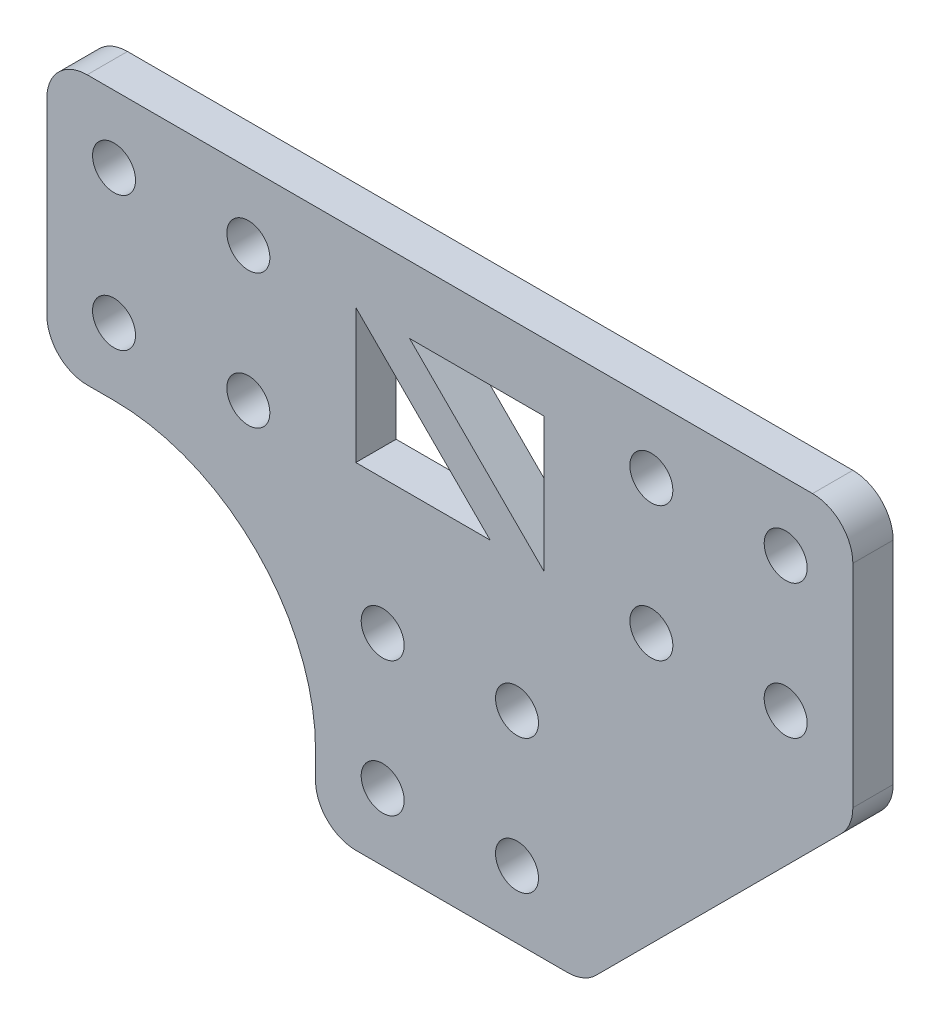
ISO-10303-21;
HEADER;
FILE_DESCRIPTION(('STEP AP214'),'2;1');
FILE_NAME('part.step','',(''),(''),'','','');
FILE_SCHEMA(('AUTOMOTIVE_DESIGN { 1 0 10303 214 1 1 1 1 }'));
ENDSEC;
DATA;
#1=APPLICATION_CONTEXT('core data for automotive mechanical design processes');
#2=APPLICATION_PROTOCOL_DEFINITION('international standard','automotive_design',2000,#1);
#3=PRODUCT_CONTEXT('',#1,'mechanical');
#4=PRODUCT('Part','Part','',(#3));
#5=PRODUCT_RELATED_PRODUCT_CATEGORY('part','',(#4));
#6=PRODUCT_DEFINITION_FORMATION('','',#4);
#7=PRODUCT_DEFINITION_CONTEXT('part definition',#1,'design');
#8=PRODUCT_DEFINITION('design','',#6,#7);
#9=PRODUCT_DEFINITION_SHAPE('','',#8);
#10=(LENGTH_UNIT() NAMED_UNIT(*) SI_UNIT(.MILLI.,.METRE.));
#11=(NAMED_UNIT(*) PLANE_ANGLE_UNIT() SI_UNIT($,.RADIAN.));
#12=(NAMED_UNIT(*) SI_UNIT($,.STERADIAN.) SOLID_ANGLE_UNIT());
#13=UNCERTAINTY_MEASURE_WITH_UNIT(LENGTH_MEASURE(1.E-05),#10,'distance_accuracy_value','');
#14=(GEOMETRIC_REPRESENTATION_CONTEXT(3) GLOBAL_UNCERTAINTY_ASSIGNED_CONTEXT((#13)) GLOBAL_UNIT_ASSIGNED_CONTEXT((#10,
#11,#12)) REPRESENTATION_CONTEXT('',''));
#15=CARTESIAN_POINT('',(0.,0.,0.));
#16=DIRECTION('',(0.,0.,1.));
#17=DIRECTION('',(1.,0.,0.));
#18=AXIS2_PLACEMENT_3D('',#15,#16,#17);
#19=CARTESIAN_POINT('',(0.,0.,3.));
#20=DIRECTION('',(0.,0.,-1.));
#21=DIRECTION('',(-1.,0.,0.));
#22=AXIS2_PLACEMENT_3D('',#19,#20,#21);
#23=PLANE('',#22);
#24=DIRECTION('',(-0.707106781186548,0.707106781186547,0.));
#25=VECTOR('',#24,1.);
#26=CARTESIAN_POINT('',(33.,-15.,3.));
#27=LINE('',#26,#25);
#28=CARTESIAN_POINT('',(33.,-15.,3.));
#29=VERTEX_POINT('',#28);
#30=CARTESIAN_POINT('',(23.,-5.,3.));
#31=VERTEX_POINT('',#30);
#32=EDGE_CURVE('E223',#29,#31,#27,.T.);
#33=ORIENTED_EDGE('',*,*,#32,.F.);
#34=DIRECTION('',(1.,0.,0.));
#35=VECTOR('',#34,1.);
#36=CARTESIAN_POINT('',(23.,-15.,3.));
#37=LINE('',#36,#35);
#38=CARTESIAN_POINT('',(23.,-15.,3.));
#39=VERTEX_POINT('',#38);
#40=EDGE_CURVE('E231',#39,#29,#37,.T.);
#41=ORIENTED_EDGE('',*,*,#40,.F.);
#42=DIRECTION('',(0.,-1.,0.));
#43=VECTOR('',#42,1.);
#44=CARTESIAN_POINT('',(23.,-5.,3.));
#45=LINE('',#44,#43);
#46=EDGE_CURVE('E226',#31,#39,#45,.T.);
#47=ORIENTED_EDGE('',*,*,#46,.F.);
#48=EDGE_LOOP('',(#33,#41,#47));
#49=FACE_BOUND('',#48,.T.);
#50=DIRECTION('',(1.,0.,0.));
#51=VECTOR('',#50,1.);
#52=CARTESIAN_POINT('',(0.,-20.,3.));
#53=LINE('',#52,#51);
#54=CARTESIAN_POINT('',(3.,-20.,3.));
#55=VERTEX_POINT('',#54);
#56=CARTESIAN_POINT('',(5.,-20.,3.));
#57=VERTEX_POINT('',#56);
#58=EDGE_CURVE('E356',#55,#57,#53,.T.);
#59=ORIENTED_EDGE('',*,*,#58,.T.);
#60=CARTESIAN_POINT('',(5.,-35.,3.));
#61=DIRECTION('',(0.,0.,-1.));
#62=DIRECTION('',(-1.,0.,0.));
#63=AXIS2_PLACEMENT_3D('',#60,#61,#62);
#64=CIRCLE('',#63,15.);
#65=CARTESIAN_POINT('',(20.,-35.,3.));
#66=VERTEX_POINT('',#65);
#67=EDGE_CURVE('E11',#57,#66,#64,.T.);
#68=ORIENTED_EDGE('',*,*,#67,.T.);
#69=DIRECTION('',(0.,-1.,0.));
#70=VECTOR('',#69,1.);
#71=CARTESIAN_POINT('',(20.,-20.,3.));
#72=LINE('',#71,#70);
#73=CARTESIAN_POINT('',(20.,-37.,3.));
#74=VERTEX_POINT('',#73);
#75=EDGE_CURVE('E360',#66,#74,#72,.T.);
#76=ORIENTED_EDGE('',*,*,#75,.T.);
#77=CARTESIAN_POINT('',(23.,-37.,3.));
#78=DIRECTION('',(0.,0.,-1.));
#79=DIRECTION('',(-1.,0.,0.));
#80=AXIS2_PLACEMENT_3D('',#77,#78,#79);
#81=CIRCLE('',#80,3.);
#82=CARTESIAN_POINT('',(23.,-40.,3.));
#83=VERTEX_POINT('',#82);
#84=EDGE_CURVE('E448',#74,#83,#81,.F.);
#85=ORIENTED_EDGE('',*,*,#84,.T.);
#86=DIRECTION('',(1.,0.,0.));
#87=VECTOR('',#86,1.);
#88=CARTESIAN_POINT('',(40.,-40.,3.));
#89=LINE('',#88,#87);
#90=CARTESIAN_POINT('',(38.7573593128807,-40.,3.));
#91=VERTEX_POINT('',#90);
#92=EDGE_CURVE('E363',#83,#91,#89,.T.);
#93=ORIENTED_EDGE('',*,*,#92,.T.);
#94=CARTESIAN_POINT('',(38.7573593128807,-37.,3.));
#95=DIRECTION('',(0.,0.,-1.));
#96=DIRECTION('',(-1.,0.,0.));
#97=AXIS2_PLACEMENT_3D('',#94,#95,#96);
#98=CIRCLE('',#97,3.);
#99=CARTESIAN_POINT('',(40.8786796564404,-39.1213203435596,3.));
#100=VERTEX_POINT('',#99);
#101=EDGE_CURVE('E439',#91,#100,#98,.F.);
#102=ORIENTED_EDGE('',*,*,#101,.T.);
#103=DIRECTION('',(0.707106781186547,0.707106781186548,0.));
#104=VECTOR('',#103,1.);
#105=CARTESIAN_POINT('',(60.,-20.,3.));
#106=LINE('',#105,#104);
#107=CARTESIAN_POINT('',(59.1213203435596,-20.8786796564404,3.));
#108=VERTEX_POINT('',#107);
#109=EDGE_CURVE('E367',#100,#108,#106,.T.);
#110=ORIENTED_EDGE('',*,*,#109,.T.);
#111=CARTESIAN_POINT('',(57.,-18.7573593128807,3.));
#112=DIRECTION('',(0.,0.,-1.));
#113=DIRECTION('',(-1.,0.,0.));
#114=AXIS2_PLACEMENT_3D('',#111,#112,#113);
#115=CIRCLE('',#114,3.);
#116=CARTESIAN_POINT('',(60.,-18.7573593128807,3.));
#117=VERTEX_POINT('',#116);
#118=EDGE_CURVE('E442',#108,#117,#115,.F.);
#119=ORIENTED_EDGE('',*,*,#118,.T.);
#120=DIRECTION('',(0.,1.,0.));
#121=VECTOR('',#120,1.);
#122=CARTESIAN_POINT('',(60.,0.,3.));
#123=LINE('',#122,#121);
#124=CARTESIAN_POINT('',(60.,-3.,3.));
#125=VERTEX_POINT('',#124);
#126=EDGE_CURVE('E371',#117,#125,#123,.T.);
#127=ORIENTED_EDGE('',*,*,#126,.T.);
#128=CARTESIAN_POINT('',(57.,-3.,3.));
#129=DIRECTION('',(0.,0.,-1.));
#130=DIRECTION('',(-1.,0.,0.));
#131=AXIS2_PLACEMENT_3D('',#128,#129,#130);
#132=CIRCLE('',#131,3.);
#133=CARTESIAN_POINT('',(57.,0.,3.));
#134=VERTEX_POINT('',#133);
#135=EDGE_CURVE('E436',#125,#134,#132,.F.);
#136=ORIENTED_EDGE('',*,*,#135,.T.);
#137=DIRECTION('',(-1.,0.,0.));
#138=VECTOR('',#137,1.);
#139=CARTESIAN_POINT('',(0.,0.,3.));
#140=LINE('',#139,#138);
#141=CARTESIAN_POINT('',(3.,0.,3.));
#142=VERTEX_POINT('',#141);
#143=EDGE_CURVE('E375',#134,#142,#140,.T.);
#144=ORIENTED_EDGE('',*,*,#143,.T.);
#145=CARTESIAN_POINT('',(3.,-3.,3.));
#146=DIRECTION('',(0.,0.,-1.));
#147=DIRECTION('',(-1.,0.,0.));
#148=AXIS2_PLACEMENT_3D('',#145,#146,#147);
#149=CIRCLE('',#148,3.);
#150=CARTESIAN_POINT('',(0.,-3.,3.));
#151=VERTEX_POINT('',#150);
#152=EDGE_CURVE('E433',#142,#151,#149,.F.);
#153=ORIENTED_EDGE('',*,*,#152,.T.);
#154=DIRECTION('',(0.,-1.,0.));
#155=VECTOR('',#154,1.);
#156=CARTESIAN_POINT('',(0.,-20.,3.));
#157=LINE('',#156,#155);
#158=CARTESIAN_POINT('',(0.,-17.,3.));
#159=VERTEX_POINT('',#158);
#160=EDGE_CURVE('E352',#151,#159,#157,.T.);
#161=ORIENTED_EDGE('',*,*,#160,.T.);
#162=CARTESIAN_POINT('',(3.,-17.,3.));
#163=DIRECTION('',(0.,0.,-1.));
#164=DIRECTION('',(-1.,0.,0.));
#165=AXIS2_PLACEMENT_3D('',#162,#163,#164);
#166=CIRCLE('',#165,3.);
#167=EDGE_CURVE('E445',#159,#55,#166,.F.);
#168=ORIENTED_EDGE('',*,*,#167,.T.);
#169=EDGE_LOOP('',(#59,#68,#76,#85,#93,#102,#110,#119,#127,#136,#144,#153,#161,#168));
#170=FACE_BOUND('',#169,.T.);
#171=CARTESIAN_POINT('',(5.,-5.,3.));
#172=DIRECTION('',(0.,0.,1.));
#173=DIRECTION('',(1.,0.,0.));
#174=AXIS2_PLACEMENT_3D('',#171,#172,#173);
#175=CIRCLE('',#174,1.6);
#176=CARTESIAN_POINT('',(6.6,-5.,3.));
#177=VERTEX_POINT('',#176);
#178=EDGE_CURVE('E344',#177,#177,#175,.T.);
#179=ORIENTED_EDGE('',*,*,#178,.F.);
#180=EDGE_LOOP('',(#179));
#181=FACE_BOUND('',#180,.T.);
#182=CARTESIAN_POINT('',(15.,-5.,3.));
#183=DIRECTION('',(0.,0.,1.));
#184=DIRECTION('',(-1.,0.,0.));
#185=AXIS2_PLACEMENT_3D('',#182,#183,#184);
#186=CIRCLE('',#185,1.6);
#187=CARTESIAN_POINT('',(13.4,-5.,3.));
#188=VERTEX_POINT('',#187);
#189=EDGE_CURVE('E336',#188,#188,#186,.T.);
#190=ORIENTED_EDGE('',*,*,#189,.F.);
#191=EDGE_LOOP('',(#190));
#192=FACE_BOUND('',#191,.T.);
#193=CARTESIAN_POINT('',(15.,-15.,3.));
#194=DIRECTION('',(0.,0.,1.));
#195=DIRECTION('',(1.,0.,0.));
#196=AXIS2_PLACEMENT_3D('',#193,#194,#195);
#197=CIRCLE('',#196,1.6);
#198=CARTESIAN_POINT('',(16.6,-15.,3.));
#199=VERTEX_POINT('',#198);
#200=EDGE_CURVE('E328',#199,#199,#197,.T.);
#201=ORIENTED_EDGE('',*,*,#200,.F.);
#202=EDGE_LOOP('',(#201));
#203=FACE_BOUND('',#202,.T.);
#204=CARTESIAN_POINT('',(5.,-15.,3.));
#205=DIRECTION('',(0.,0.,1.));
#206=DIRECTION('',(-1.,0.,0.));
#207=AXIS2_PLACEMENT_3D('',#204,#205,#206);
#208=CIRCLE('',#207,1.6);
#209=CARTESIAN_POINT('',(3.4,-15.,3.));
#210=VERTEX_POINT('',#209);
#211=EDGE_CURVE('E320',#210,#210,#208,.T.);
#212=ORIENTED_EDGE('',*,*,#211,.F.);
#213=EDGE_LOOP('',(#212));
#214=FACE_BOUND('',#213,.T.);
#215=CARTESIAN_POINT('',(55.,-15.,3.));
#216=DIRECTION('',(0.,0.,1.));
#217=DIRECTION('',(1.,0.,0.));
#218=AXIS2_PLACEMENT_3D('',#215,#216,#217);
#219=CIRCLE('',#218,1.59999999999999);
#220=CARTESIAN_POINT('',(56.6,-15.,3.));
#221=VERTEX_POINT('',#220);
#222=EDGE_CURVE('E312',#221,#221,#219,.T.);
#223=ORIENTED_EDGE('',*,*,#222,.F.);
#224=EDGE_LOOP('',(#223));
#225=FACE_BOUND('',#224,.T.);
#226=CARTESIAN_POINT('',(45.,-15.,3.));
#227=DIRECTION('',(0.,0.,1.));
#228=DIRECTION('',(-1.,0.,0.));
#229=AXIS2_PLACEMENT_3D('',#226,#227,#228);
#230=CIRCLE('',#229,1.6);
#231=CARTESIAN_POINT('',(43.4,-15.,3.));
#232=VERTEX_POINT('',#231);
#233=EDGE_CURVE('E304',#232,#232,#230,.T.);
#234=ORIENTED_EDGE('',*,*,#233,.F.);
#235=EDGE_LOOP('',(#234));
#236=FACE_BOUND('',#235,.T.);
#237=CARTESIAN_POINT('',(45.,-4.99999999999999,3.));
#238=DIRECTION('',(0.,0.,1.));
#239=DIRECTION('',(1.,0.,0.));
#240=AXIS2_PLACEMENT_3D('',#237,#238,#239);
#241=CIRCLE('',#240,1.6);
#242=CARTESIAN_POINT('',(46.6,-4.99999999999999,3.));
#243=VERTEX_POINT('',#242);
#244=EDGE_CURVE('E296',#243,#243,#241,.T.);
#245=ORIENTED_EDGE('',*,*,#244,.F.);
#246=EDGE_LOOP('',(#245));
#247=FACE_BOUND('',#246,.T.);
#248=CARTESIAN_POINT('',(55.,-4.99999999999999,3.));
#249=DIRECTION('',(0.,0.,1.));
#250=DIRECTION('',(-1.,0.,0.));
#251=AXIS2_PLACEMENT_3D('',#248,#249,#250);
#252=CIRCLE('',#251,1.59999999999999);
#253=CARTESIAN_POINT('',(53.4,-4.99999999999999,3.));
#254=VERTEX_POINT('',#253);
#255=EDGE_CURVE('E288',#254,#254,#252,.T.);
#256=ORIENTED_EDGE('',*,*,#255,.F.);
#257=EDGE_LOOP('',(#256));
#258=FACE_BOUND('',#257,.T.);
#259=CARTESIAN_POINT('',(25.,-35.,3.));
#260=DIRECTION('',(0.,0.,1.));
#261=DIRECTION('',(1.,0.,0.));
#262=AXIS2_PLACEMENT_3D('',#259,#260,#261);
#263=CIRCLE('',#262,1.6);
#264=CARTESIAN_POINT('',(26.6,-35.,3.));
#265=VERTEX_POINT('',#264);
#266=EDGE_CURVE('E280',#265,#265,#263,.T.);
#267=ORIENTED_EDGE('',*,*,#266,.F.);
#268=EDGE_LOOP('',(#267));
#269=FACE_BOUND('',#268,.T.);
#270=CARTESIAN_POINT('',(35.,-35.,3.));
#271=DIRECTION('',(0.,0.,1.));
#272=DIRECTION('',(-1.,0.,0.));
#273=AXIS2_PLACEMENT_3D('',#270,#271,#272);
#274=CIRCLE('',#273,1.6);
#275=CARTESIAN_POINT('',(33.4,-35.,3.));
#276=VERTEX_POINT('',#275);
#277=EDGE_CURVE('E272',#276,#276,#274,.T.);
#278=ORIENTED_EDGE('',*,*,#277,.F.);
#279=EDGE_LOOP('',(#278));
#280=FACE_BOUND('',#279,.T.);
#281=CARTESIAN_POINT('',(35.,-25.,3.));
#282=DIRECTION('',(0.,0.,1.));
#283=DIRECTION('',(1.,0.,0.));
#284=AXIS2_PLACEMENT_3D('',#281,#282,#283);
#285=CIRCLE('',#284,1.6);
#286=CARTESIAN_POINT('',(36.6,-25.,3.));
#287=VERTEX_POINT('',#286);
#288=EDGE_CURVE('E264',#287,#287,#285,.T.);
#289=ORIENTED_EDGE('',*,*,#288,.F.);
#290=EDGE_LOOP('',(#289));
#291=FACE_BOUND('',#290,.T.);
#292=CARTESIAN_POINT('',(25.,-25.,3.));
#293=DIRECTION('',(0.,0.,1.));
#294=DIRECTION('',(-1.,0.,0.));
#295=AXIS2_PLACEMENT_3D('',#292,#293,#294);
#296=CIRCLE('',#295,1.6);
#297=CARTESIAN_POINT('',(23.4,-25.,3.));
#298=VERTEX_POINT('',#297);
#299=EDGE_CURVE('E256',#298,#298,#296,.T.);
#300=ORIENTED_EDGE('',*,*,#299,.F.);
#301=EDGE_LOOP('',(#300));
#302=FACE_BOUND('',#301,.T.);
#303=DIRECTION('',(0.707106781186547,-0.707106781186548,0.));
#304=VECTOR('',#303,1.);
#305=CARTESIAN_POINT('',(37.,-15.,3.));
#306=LINE('',#305,#304);
#307=CARTESIAN_POINT('',(27.,-5.,3.));
#308=VERTEX_POINT('',#307);
#309=CARTESIAN_POINT('',(37.,-15.,3.));
#310=VERTEX_POINT('',#309);
#311=EDGE_CURVE('E182',#308,#310,#306,.T.);
#312=ORIENTED_EDGE('',*,*,#311,.F.);
#313=DIRECTION('',(-1.,0.,0.));
#314=VECTOR('',#313,1.);
#315=CARTESIAN_POINT('',(27.,-5.,3.));
#316=LINE('',#315,#314);
#317=CARTESIAN_POINT('',(37.,-5.,3.));
#318=VERTEX_POINT('',#317);
#319=EDGE_CURVE('E205',#318,#308,#316,.T.);
#320=ORIENTED_EDGE('',*,*,#319,.F.);
#321=DIRECTION('',(0.,1.,0.));
#322=VECTOR('',#321,1.);
#323=CARTESIAN_POINT('',(37.,-5.,3.));
#324=LINE('',#323,#322);
#325=EDGE_CURVE('E193',#310,#318,#324,.T.);
#326=ORIENTED_EDGE('',*,*,#325,.F.);
#327=EDGE_LOOP('',(#312,#320,#326));
#328=FACE_BOUND('',#327,.T.);
#329=ADVANCED_FACE('F43',(#49,#170,#181,#192,#203,#214,#225,#236,#247,#258,#269,#280,#291,#302,
#328),#23,.F.);
#330=CARTESIAN_POINT('',(0.,0.,0.));
#331=DIRECTION('',(0.,0.,-1.));
#332=DIRECTION('',(-1.,0.,0.));
#333=AXIS2_PLACEMENT_3D('',#330,#331,#332);
#334=PLANE('',#333);
#335=CARTESIAN_POINT('',(35.,-25.,0.));
#336=DIRECTION('',(0.,0.,1.));
#337=DIRECTION('',(1.,0.,0.));
#338=AXIS2_PLACEMENT_3D('',#335,#336,#337);
#339=CIRCLE('',#338,1.6);
#340=CARTESIAN_POINT('',(36.6,-25.,0.));
#341=VERTEX_POINT('',#340);
#342=EDGE_CURVE('E260',#341,#341,#339,.T.);
#343=ORIENTED_EDGE('',*,*,#342,.T.);
#344=EDGE_LOOP('',(#343));
#345=FACE_BOUND('',#344,.T.);
#346=CARTESIAN_POINT('',(25.,-35.,0.));
#347=DIRECTION('',(0.,0.,1.));
#348=DIRECTION('',(1.,0.,0.));
#349=AXIS2_PLACEMENT_3D('',#346,#347,#348);
#350=CIRCLE('',#349,1.6);
#351=CARTESIAN_POINT('',(26.6,-35.,0.));
#352=VERTEX_POINT('',#351);
#353=EDGE_CURVE('E276',#352,#352,#350,.T.);
#354=ORIENTED_EDGE('',*,*,#353,.T.);
#355=EDGE_LOOP('',(#354));
#356=FACE_BOUND('',#355,.T.);
#357=CARTESIAN_POINT('',(45.,-4.99999999999999,0.));
#358=DIRECTION('',(0.,0.,1.));
#359=DIRECTION('',(1.,0.,0.));
#360=AXIS2_PLACEMENT_3D('',#357,#358,#359);
#361=CIRCLE('',#360,1.6);
#362=CARTESIAN_POINT('',(46.6,-4.99999999999999,0.));
#363=VERTEX_POINT('',#362);
#364=EDGE_CURVE('E292',#363,#363,#361,.T.);
#365=ORIENTED_EDGE('',*,*,#364,.T.);
#366=EDGE_LOOP('',(#365));
#367=FACE_BOUND('',#366,.T.);
#368=CARTESIAN_POINT('',(55.,-15.,0.));
#369=DIRECTION('',(0.,0.,1.));
#370=DIRECTION('',(1.,0.,0.));
#371=AXIS2_PLACEMENT_3D('',#368,#369,#370);
#372=CIRCLE('',#371,1.59999999999999);
#373=CARTESIAN_POINT('',(56.6,-15.,0.));
#374=VERTEX_POINT('',#373);
#375=EDGE_CURVE('E308',#374,#374,#372,.T.);
#376=ORIENTED_EDGE('',*,*,#375,.T.);
#377=EDGE_LOOP('',(#376));
#378=FACE_BOUND('',#377,.T.);
#379=CARTESIAN_POINT('',(15.,-15.,0.));
#380=DIRECTION('',(0.,0.,1.));
#381=DIRECTION('',(1.,0.,0.));
#382=AXIS2_PLACEMENT_3D('',#379,#380,#381);
#383=CIRCLE('',#382,1.6);
#384=CARTESIAN_POINT('',(16.6,-15.,0.));
#385=VERTEX_POINT('',#384);
#386=EDGE_CURVE('E324',#385,#385,#383,.T.);
#387=ORIENTED_EDGE('',*,*,#386,.T.);
#388=EDGE_LOOP('',(#387));
#389=FACE_BOUND('',#388,.T.);
#390=CARTESIAN_POINT('',(5.,-5.,0.));
#391=DIRECTION('',(0.,0.,1.));
#392=DIRECTION('',(1.,0.,0.));
#393=AXIS2_PLACEMENT_3D('',#390,#391,#392);
#394=CIRCLE('',#393,1.6);
#395=CARTESIAN_POINT('',(6.6,-5.,0.));
#396=VERTEX_POINT('',#395);
#397=EDGE_CURVE('E340',#396,#396,#394,.T.);
#398=ORIENTED_EDGE('',*,*,#397,.T.);
#399=EDGE_LOOP('',(#398));
#400=FACE_BOUND('',#399,.T.);
#401=DIRECTION('',(1.,0.,0.));
#402=VECTOR('',#401,1.);
#403=CARTESIAN_POINT('',(40.,-40.,0.));
#404=LINE('',#403,#402);
#405=CARTESIAN_POINT('',(23.,-40.,0.));
#406=VERTEX_POINT('',#405);
#407=CARTESIAN_POINT('',(38.7573593128807,-40.,0.));
#408=VERTEX_POINT('',#407);
#409=EDGE_CURVE('E389',#406,#408,#404,.T.);
#410=ORIENTED_EDGE('',*,*,#409,.F.);
#411=CARTESIAN_POINT('',(23.,-37.,0.));
#412=DIRECTION('',(0.,0.,-1.));
#413=DIRECTION('',(-1.,0.,0.));
#414=AXIS2_PLACEMENT_3D('',#411,#412,#413);
#415=CIRCLE('',#414,3.);
#416=CARTESIAN_POINT('',(20.,-37.,0.));
#417=VERTEX_POINT('',#416);
#418=EDGE_CURVE('E425',#406,#417,#415,.T.);
#419=ORIENTED_EDGE('',*,*,#418,.T.);
#420=DIRECTION('',(0.,-1.,0.));
#421=VECTOR('',#420,1.);
#422=CARTESIAN_POINT('',(20.,-20.,0.));
#423=LINE('',#422,#421);
#424=CARTESIAN_POINT('',(20.,-35.,0.));
#425=VERTEX_POINT('',#424);
#426=EDGE_CURVE('E386',#425,#417,#423,.T.);
#427=ORIENTED_EDGE('',*,*,#426,.F.);
#428=CARTESIAN_POINT('',(5.,-35.,0.));
#429=DIRECTION('',(0.,0.,-1.));
#430=DIRECTION('',(-1.,0.,0.));
#431=AXIS2_PLACEMENT_3D('',#428,#429,#430);
#432=CIRCLE('',#431,15.);
#433=CARTESIAN_POINT('',(5.,-20.,0.));
#434=VERTEX_POINT('',#433);
#435=EDGE_CURVE('E52',#425,#434,#432,.F.);
#436=ORIENTED_EDGE('',*,*,#435,.T.);
#437=DIRECTION('',(1.,0.,0.));
#438=VECTOR('',#437,1.);
#439=CARTESIAN_POINT('',(0.,-20.,0.));
#440=LINE('',#439,#438);
#441=CARTESIAN_POINT('',(3.,-20.,0.));
#442=VERTEX_POINT('',#441);
#443=EDGE_CURVE('E383',#442,#434,#440,.T.);
#444=ORIENTED_EDGE('',*,*,#443,.F.);
#445=CARTESIAN_POINT('',(3.,-17.,0.));
#446=DIRECTION('',(0.,0.,-1.));
#447=DIRECTION('',(-1.,0.,0.));
#448=AXIS2_PLACEMENT_3D('',#445,#446,#447);
#449=CIRCLE('',#448,3.);
#450=CARTESIAN_POINT('',(0.,-17.,0.));
#451=VERTEX_POINT('',#450);
#452=EDGE_CURVE('E422',#442,#451,#449,.T.);
#453=ORIENTED_EDGE('',*,*,#452,.T.);
#454=DIRECTION('',(0.,-1.,0.));
#455=VECTOR('',#454,1.);
#456=CARTESIAN_POINT('',(0.,-20.,0.));
#457=LINE('',#456,#455);
#458=CARTESIAN_POINT('',(0.,-3.,0.));
#459=VERTEX_POINT('',#458);
#460=EDGE_CURVE('E348',#459,#451,#457,.T.);
#461=ORIENTED_EDGE('',*,*,#460,.F.);
#462=CARTESIAN_POINT('',(3.,-3.,0.));
#463=DIRECTION('',(0.,0.,-1.));
#464=DIRECTION('',(-1.,0.,0.));
#465=AXIS2_PLACEMENT_3D('',#462,#463,#464);
#466=CIRCLE('',#465,3.);
#467=CARTESIAN_POINT('',(3.,0.,0.));
#468=VERTEX_POINT('',#467);
#469=EDGE_CURVE('E410',#459,#468,#466,.T.);
#470=ORIENTED_EDGE('',*,*,#469,.T.);
#471=DIRECTION('',(-1.,0.,0.));
#472=VECTOR('',#471,1.);
#473=CARTESIAN_POINT('',(0.,0.,0.));
#474=LINE('',#473,#472);
#475=CARTESIAN_POINT('',(57.,0.,0.));
#476=VERTEX_POINT('',#475);
#477=EDGE_CURVE('E357',#476,#468,#474,.T.);
#478=ORIENTED_EDGE('',*,*,#477,.F.);
#479=CARTESIAN_POINT('',(57.,-3.,0.));
#480=DIRECTION('',(0.,0.,-1.));
#481=DIRECTION('',(-1.,0.,0.));
#482=AXIS2_PLACEMENT_3D('',#479,#480,#481);
#483=CIRCLE('',#482,3.);
#484=CARTESIAN_POINT('',(60.,-3.,0.));
#485=VERTEX_POINT('',#484);
#486=EDGE_CURVE('E413',#476,#485,#483,.T.);
#487=ORIENTED_EDGE('',*,*,#486,.T.);
#488=DIRECTION('',(0.,1.,0.));
#489=VECTOR('',#488,1.);
#490=CARTESIAN_POINT('',(60.,0.,0.));
#491=LINE('',#490,#489);
#492=CARTESIAN_POINT('',(60.,-18.7573593128807,0.));
#493=VERTEX_POINT('',#492);
#494=EDGE_CURVE('E397',#493,#485,#491,.T.);
#495=ORIENTED_EDGE('',*,*,#494,.F.);
#496=CARTESIAN_POINT('',(57.,-18.7573593128807,0.));
#497=DIRECTION('',(0.,0.,-1.));
#498=DIRECTION('',(-1.,0.,0.));
#499=AXIS2_PLACEMENT_3D('',#496,#497,#498);
#500=CIRCLE('',#499,3.);
#501=CARTESIAN_POINT('',(59.1213203435596,-20.8786796564404,0.));
#502=VERTEX_POINT('',#501);
#503=EDGE_CURVE('E419',#493,#502,#500,.T.);
#504=ORIENTED_EDGE('',*,*,#503,.T.);
#505=DIRECTION('',(0.707106781186547,0.707106781186548,0.));
#506=VECTOR('',#505,1.);
#507=CARTESIAN_POINT('',(60.,-20.,0.));
#508=LINE('',#507,#506);
#509=CARTESIAN_POINT('',(40.8786796564404,-39.1213203435596,0.));
#510=VERTEX_POINT('',#509);
#511=EDGE_CURVE('E393',#510,#502,#508,.T.);
#512=ORIENTED_EDGE('',*,*,#511,.F.);
#513=CARTESIAN_POINT('',(38.7573593128807,-37.,0.));
#514=DIRECTION('',(0.,0.,-1.));
#515=DIRECTION('',(-1.,0.,0.));
#516=AXIS2_PLACEMENT_3D('',#513,#514,#515);
#517=CIRCLE('',#516,3.);
#518=EDGE_CURVE('E416',#510,#408,#517,.T.);
#519=ORIENTED_EDGE('',*,*,#518,.T.);
#520=EDGE_LOOP('',(#410,#419,#427,#436,#444,#453,#461,#470,#478,#487,#495,#504,#512,#519));
#521=FACE_BOUND('',#520,.T.);
#522=CARTESIAN_POINT('',(15.,-5.,0.));
#523=DIRECTION('',(0.,0.,1.));
#524=DIRECTION('',(-1.,0.,0.));
#525=AXIS2_PLACEMENT_3D('',#522,#523,#524);
#526=CIRCLE('',#525,1.6);
#527=CARTESIAN_POINT('',(13.4,-5.,0.));
#528=VERTEX_POINT('',#527);
#529=EDGE_CURVE('E332',#528,#528,#526,.T.);
#530=ORIENTED_EDGE('',*,*,#529,.T.);
#531=EDGE_LOOP('',(#530));
#532=FACE_BOUND('',#531,.T.);
#533=CARTESIAN_POINT('',(5.,-15.,0.));
#534=DIRECTION('',(0.,0.,1.));
#535=DIRECTION('',(-1.,0.,0.));
#536=AXIS2_PLACEMENT_3D('',#533,#534,#535);
#537=CIRCLE('',#536,1.6);
#538=CARTESIAN_POINT('',(3.4,-15.,0.));
#539=VERTEX_POINT('',#538);
#540=EDGE_CURVE('E316',#539,#539,#537,.T.);
#541=ORIENTED_EDGE('',*,*,#540,.T.);
#542=EDGE_LOOP('',(#541));
#543=FACE_BOUND('',#542,.T.);
#544=CARTESIAN_POINT('',(45.,-15.,0.));
#545=DIRECTION('',(0.,0.,1.));
#546=DIRECTION('',(-1.,0.,0.));
#547=AXIS2_PLACEMENT_3D('',#544,#545,#546);
#548=CIRCLE('',#547,1.6);
#549=CARTESIAN_POINT('',(43.4,-15.,0.));
#550=VERTEX_POINT('',#549);
#551=EDGE_CURVE('E300',#550,#550,#548,.T.);
#552=ORIENTED_EDGE('',*,*,#551,.T.);
#553=EDGE_LOOP('',(#552));
#554=FACE_BOUND('',#553,.T.);
#555=CARTESIAN_POINT('',(55.,-4.99999999999999,0.));
#556=DIRECTION('',(0.,0.,1.));
#557=DIRECTION('',(-1.,0.,0.));
#558=AXIS2_PLACEMENT_3D('',#555,#556,#557);
#559=CIRCLE('',#558,1.59999999999999);
#560=CARTESIAN_POINT('',(53.4,-4.99999999999999,0.));
#561=VERTEX_POINT('',#560);
#562=EDGE_CURVE('E284',#561,#561,#559,.T.);
#563=ORIENTED_EDGE('',*,*,#562,.T.);
#564=EDGE_LOOP('',(#563));
#565=FACE_BOUND('',#564,.T.);
#566=CARTESIAN_POINT('',(35.,-35.,0.));
#567=DIRECTION('',(0.,0.,1.));
#568=DIRECTION('',(-1.,0.,0.));
#569=AXIS2_PLACEMENT_3D('',#566,#567,#568);
#570=CIRCLE('',#569,1.6);
#571=CARTESIAN_POINT('',(33.4,-35.,0.));
#572=VERTEX_POINT('',#571);
#573=EDGE_CURVE('E268',#572,#572,#570,.T.);
#574=ORIENTED_EDGE('',*,*,#573,.T.);
#575=EDGE_LOOP('',(#574));
#576=FACE_BOUND('',#575,.T.);
#577=CARTESIAN_POINT('',(25.,-25.,0.));
#578=DIRECTION('',(0.,0.,1.));
#579=DIRECTION('',(-1.,0.,0.));
#580=AXIS2_PLACEMENT_3D('',#577,#578,#579);
#581=CIRCLE('',#580,1.6);
#582=CARTESIAN_POINT('',(23.4,-25.,0.));
#583=VERTEX_POINT('',#582);
#584=EDGE_CURVE('E255',#583,#583,#581,.T.);
#585=ORIENTED_EDGE('',*,*,#584,.T.);
#586=EDGE_LOOP('',(#585));
#587=FACE_BOUND('',#586,.T.);
#588=DIRECTION('',(1.,0.,0.));
#589=VECTOR('',#588,1.);
#590=CARTESIAN_POINT('',(23.,-15.,0.));
#591=LINE('',#590,#589);
#592=CARTESIAN_POINT('',(23.,-15.,0.));
#593=VERTEX_POINT('',#592);
#594=CARTESIAN_POINT('',(33.,-15.,0.));
#595=VERTEX_POINT('',#594);
#596=EDGE_CURVE('E227',#593,#595,#591,.T.);
#597=ORIENTED_EDGE('',*,*,#596,.T.);
#598=DIRECTION('',(-0.707106781186548,0.707106781186547,0.));
#599=VECTOR('',#598,1.);
#600=CARTESIAN_POINT('',(33.,-15.,0.));
#601=LINE('',#600,#599);
#602=CARTESIAN_POINT('',(23.,-5.,0.));
#603=VERTEX_POINT('',#602);
#604=EDGE_CURVE('E202',#595,#603,#601,.T.);
#605=ORIENTED_EDGE('',*,*,#604,.T.);
#606=DIRECTION('',(0.,-1.,0.));
#607=VECTOR('',#606,1.);
#608=CARTESIAN_POINT('',(23.,-5.,0.));
#609=LINE('',#608,#607);
#610=EDGE_CURVE('E238',#603,#593,#609,.T.);
#611=ORIENTED_EDGE('',*,*,#610,.T.);
#612=EDGE_LOOP('',(#597,#605,#611));
#613=FACE_BOUND('',#612,.T.);
#614=DIRECTION('',(-1.,0.,0.));
#615=VECTOR('',#614,1.);
#616=CARTESIAN_POINT('',(27.,-5.,0.));
#617=LINE('',#616,#615);
#618=CARTESIAN_POINT('',(37.,-5.,0.));
#619=VERTEX_POINT('',#618);
#620=CARTESIAN_POINT('',(27.,-5.,0.));
#621=VERTEX_POINT('',#620);
#622=EDGE_CURVE('E194',#619,#621,#617,.T.);
#623=ORIENTED_EDGE('',*,*,#622,.T.);
#624=DIRECTION('',(0.707106781186547,-0.707106781186548,0.));
#625=VECTOR('',#624,1.);
#626=CARTESIAN_POINT('',(37.,-15.,0.));
#627=LINE('',#626,#625);
#628=CARTESIAN_POINT('',(37.,-15.,0.));
#629=VERTEX_POINT('',#628);
#630=EDGE_CURVE('E211',#621,#629,#627,.T.);
#631=ORIENTED_EDGE('',*,*,#630,.T.);
#632=DIRECTION('',(0.,1.,0.));
#633=VECTOR('',#632,1.);
#634=CARTESIAN_POINT('',(37.,-5.,0.));
#635=LINE('',#634,#633);
#636=EDGE_CURVE('E200',#629,#619,#635,.T.);
#637=ORIENTED_EDGE('',*,*,#636,.T.);
#638=EDGE_LOOP('',(#623,#631,#637));
#639=FACE_BOUND('',#638,.T.);
#640=ADVANCED_FACE('F496',(#345,#356,#367,#378,#389,#400,#521,#532,#543,#554,#565,#576,#587,
#613,#639),#334,.T.);
#641=CARTESIAN_POINT('',(0.,-20.,3.));
#642=DIRECTION('',(1.,0.,0.));
#643=DIRECTION('',(0.,0.,-1.));
#644=AXIS2_PLACEMENT_3D('',#641,#642,#643);
#645=PLANE('',#644);
#646=ORIENTED_EDGE('',*,*,#460,.T.);
#647=DIRECTION('',(0.,0.,-1.));
#648=VECTOR('',#647,1.);
#649=CARTESIAN_POINT('',(0.,-17.,3.));
#650=LINE('',#649,#648);
#651=EDGE_CURVE('E459',#451,#159,#650,.F.);
#652=ORIENTED_EDGE('',*,*,#651,.T.);
#653=ORIENTED_EDGE('',*,*,#160,.F.);
#654=DIRECTION('',(0.,0.,-1.));
#655=VECTOR('',#654,1.);
#656=CARTESIAN_POINT('',(0.,-3.,3.));
#657=LINE('',#656,#655);
#658=EDGE_CURVE('E455',#151,#459,#657,.T.);
#659=ORIENTED_EDGE('',*,*,#658,.T.);
#660=EDGE_LOOP('',(#646,#652,#653,#659));
#661=FACE_BOUND('',#660,.T.);
#662=ADVANCED_FACE('F543',(#661),#645,.F.);
#663=CARTESIAN_POINT('',(0.,-20.,3.));
#664=DIRECTION('',(0.,1.,0.));
#665=DIRECTION('',(0.,0.,1.));
#666=AXIS2_PLACEMENT_3D('',#663,#664,#665);
#667=PLANE('',#666);
#668=ORIENTED_EDGE('',*,*,#443,.T.);
#669=DIRECTION('',(0.,0.,-1.));
#670=VECTOR('',#669,1.);
#671=CARTESIAN_POINT('',(5.,-20.,3.));
#672=LINE('',#671,#670);
#673=EDGE_CURVE('E65',#434,#57,#672,.F.);
#674=ORIENTED_EDGE('',*,*,#673,.T.);
#675=ORIENTED_EDGE('',*,*,#58,.F.);
#676=DIRECTION('',(0.,0.,-1.));
#677=VECTOR('',#676,1.);
#678=CARTESIAN_POINT('',(3.,-20.,3.));
#679=LINE('',#678,#677);
#680=EDGE_CURVE('E451',#55,#442,#679,.T.);
#681=ORIENTED_EDGE('',*,*,#680,.T.);
#682=EDGE_LOOP('',(#668,#674,#675,#681));
#683=FACE_BOUND('',#682,.T.);
#684=ADVANCED_FACE('F549',(#683),#667,.F.);
#685=CARTESIAN_POINT('',(20.,-20.,3.));
#686=DIRECTION('',(1.,0.,0.));
#687=DIRECTION('',(0.,0.,-1.));
#688=AXIS2_PLACEMENT_3D('',#685,#686,#687);
#689=PLANE('',#688);
#690=ORIENTED_EDGE('',*,*,#75,.F.);
#691=DIRECTION('',(0.,0.,-1.));
#692=VECTOR('',#691,1.);
#693=CARTESIAN_POINT('',(20.,-35.,0.));
#694=LINE('',#693,#692);
#695=EDGE_CURVE('E483',#66,#425,#694,.T.);
#696=ORIENTED_EDGE('',*,*,#695,.T.);
#697=ORIENTED_EDGE('',*,*,#426,.T.);
#698=DIRECTION('',(0.,0.,-1.));
#699=VECTOR('',#698,1.);
#700=CARTESIAN_POINT('',(20.,-37.,3.));
#701=LINE('',#700,#699);
#702=EDGE_CURVE('E429',#417,#74,#701,.F.);
#703=ORIENTED_EDGE('',*,*,#702,.T.);
#704=EDGE_LOOP('',(#690,#696,#697,#703));
#705=FACE_BOUND('',#704,.T.);
#706=ADVANCED_FACE('F492',(#705),#689,.F.);
#707=CARTESIAN_POINT('',(40.,-40.,3.));
#708=DIRECTION('',(0.,1.,0.));
#709=DIRECTION('',(0.,0.,1.));
#710=AXIS2_PLACEMENT_3D('',#707,#708,#709);
#711=PLANE('',#710);
#712=ORIENTED_EDGE('',*,*,#92,.F.);
#713=DIRECTION('',(0.,0.,-1.));
#714=VECTOR('',#713,1.);
#715=CARTESIAN_POINT('',(23.,-40.,3.));
#716=LINE('',#715,#714);
#717=EDGE_CURVE('E406',#83,#406,#716,.T.);
#718=ORIENTED_EDGE('',*,*,#717,.T.);
#719=ORIENTED_EDGE('',*,*,#409,.T.);
#720=DIRECTION('',(0.,0.,-1.));
#721=VECTOR('',#720,1.);
#722=CARTESIAN_POINT('',(38.7573593128807,-40.,3.));
#723=LINE('',#722,#721);
#724=EDGE_CURVE('E379',#408,#91,#723,.F.);
#725=ORIENTED_EDGE('',*,*,#724,.T.);
#726=EDGE_LOOP('',(#712,#718,#719,#725));
#727=FACE_BOUND('',#726,.T.);
#728=ADVANCED_FACE('F508',(#727),#711,.F.);
#729=CARTESIAN_POINT('',(60.,-20.,3.));
#730=DIRECTION('',(-0.707106781186548,0.707106781186547,0.));
#731=DIRECTION('',(-0.707106781186547,-0.707106781186548,0.));
#732=AXIS2_PLACEMENT_3D('',#729,#730,#731);
#733=PLANE('',#732);
#734=ORIENTED_EDGE('',*,*,#511,.T.);
#735=DIRECTION('',(0.,0.,-1.));
#736=VECTOR('',#735,1.);
#737=CARTESIAN_POINT('',(59.1213203435596,-20.8786796564404,3.));
#738=LINE('',#737,#736);
#739=EDGE_CURVE('E473',#502,#108,#738,.F.);
#740=ORIENTED_EDGE('',*,*,#739,.T.);
#741=ORIENTED_EDGE('',*,*,#109,.F.);
#742=DIRECTION('',(0.,0.,-1.));
#743=VECTOR('',#742,1.);
#744=CARTESIAN_POINT('',(40.8786796564404,-39.1213203435596,3.));
#745=LINE('',#744,#743);
#746=EDGE_CURVE('E469',#100,#510,#745,.T.);
#747=ORIENTED_EDGE('',*,*,#746,.T.);
#748=EDGE_LOOP('',(#734,#740,#741,#747));
#749=FACE_BOUND('',#748,.T.);
#750=ADVANCED_FACE('F516',(#749),#733,.F.);
#751=CARTESIAN_POINT('',(60.,0.,3.));
#752=DIRECTION('',(-1.,0.,0.));
#753=DIRECTION('',(0.,0.,1.));
#754=AXIS2_PLACEMENT_3D('',#751,#752,#753);
#755=PLANE('',#754);
#756=ORIENTED_EDGE('',*,*,#126,.F.);
#757=DIRECTION('',(0.,0.,-1.));
#758=VECTOR('',#757,1.);
#759=CARTESIAN_POINT('',(60.,-18.7573593128807,3.));
#760=LINE('',#759,#758);
#761=EDGE_CURVE('E465',#117,#493,#760,.T.);
#762=ORIENTED_EDGE('',*,*,#761,.T.);
#763=ORIENTED_EDGE('',*,*,#494,.T.);
#764=DIRECTION('',(0.,0.,-1.));
#765=VECTOR('',#764,1.);
#766=CARTESIAN_POINT('',(60.,-3.,3.));
#767=LINE('',#766,#765);
#768=EDGE_CURVE('E462',#485,#125,#767,.F.);
#769=ORIENTED_EDGE('',*,*,#768,.T.);
#770=EDGE_LOOP('',(#756,#762,#763,#769));
#771=FACE_BOUND('',#770,.T.);
#772=ADVANCED_FACE('F525',(#771),#755,.F.);
#773=CARTESIAN_POINT('',(0.,0.,3.));
#774=DIRECTION('',(0.,-1.,0.));
#775=DIRECTION('',(0.,0.,-1.));
#776=AXIS2_PLACEMENT_3D('',#773,#774,#775);
#777=PLANE('',#776);
#778=ORIENTED_EDGE('',*,*,#143,.F.);
#779=DIRECTION('',(0.,0.,-1.));
#780=VECTOR('',#779,1.);
#781=CARTESIAN_POINT('',(57.,0.,3.));
#782=LINE('',#781,#780);
#783=EDGE_CURVE('E479',#134,#476,#782,.T.);
#784=ORIENTED_EDGE('',*,*,#783,.T.);
#785=ORIENTED_EDGE('',*,*,#477,.T.);
#786=DIRECTION('',(0.,0.,-1.));
#787=VECTOR('',#786,1.);
#788=CARTESIAN_POINT('',(3.,0.,3.));
#789=LINE('',#788,#787);
#790=EDGE_CURVE('E476',#468,#142,#789,.F.);
#791=ORIENTED_EDGE('',*,*,#790,.T.);
#792=EDGE_LOOP('',(#778,#784,#785,#791));
#793=FACE_BOUND('',#792,.T.);
#794=ADVANCED_FACE('F534',(#793),#777,.F.);
#795=CARTESIAN_POINT('',(5.,-5.,3.));
#796=DIRECTION('',(0.,0.,-1.));
#797=DIRECTION('',(-1.,0.,0.));
#798=AXIS2_PLACEMENT_3D('',#795,#796,#797);
#799=CYLINDRICAL_SURFACE('',#798,1.6);
#800=ORIENTED_EDGE('',*,*,#178,.T.);
#801=EDGE_LOOP('',(#800));
#802=FACE_BOUND('',#801,.T.);
#803=ORIENTED_EDGE('',*,*,#397,.F.);
#804=EDGE_LOOP('',(#803));
#805=FACE_BOUND('',#804,.T.);
#806=ADVANCED_FACE('F564',(#802,#805),#799,.F.);
#807=CARTESIAN_POINT('',(15.,-5.,3.));
#808=DIRECTION('',(0.,0.,-1.));
#809=DIRECTION('',(-1.,0.,0.));
#810=AXIS2_PLACEMENT_3D('',#807,#808,#809);
#811=CYLINDRICAL_SURFACE('',#810,1.6);
#812=ORIENTED_EDGE('',*,*,#189,.T.);
#813=EDGE_LOOP('',(#812));
#814=FACE_BOUND('',#813,.T.);
#815=ORIENTED_EDGE('',*,*,#529,.F.);
#816=EDGE_LOOP('',(#815));
#817=FACE_BOUND('',#816,.T.);
#818=ADVANCED_FACE('F817',(#814,#817),#811,.F.);
#819=CARTESIAN_POINT('',(15.,-15.,3.));
#820=DIRECTION('',(0.,0.,-1.));
#821=DIRECTION('',(-1.,0.,0.));
#822=AXIS2_PLACEMENT_3D('',#819,#820,#821);
#823=CYLINDRICAL_SURFACE('',#822,1.6);
#824=ORIENTED_EDGE('',*,*,#200,.T.);
#825=EDGE_LOOP('',(#824));
#826=FACE_BOUND('',#825,.T.);
#827=ORIENTED_EDGE('',*,*,#386,.F.);
#828=EDGE_LOOP('',(#827));
#829=FACE_BOUND('',#828,.T.);
#830=ADVANCED_FACE('F807',(#826,#829),#823,.F.);
#831=CARTESIAN_POINT('',(5.,-15.,3.));
#832=DIRECTION('',(0.,0.,-1.));
#833=DIRECTION('',(-1.,0.,0.));
#834=AXIS2_PLACEMENT_3D('',#831,#832,#833);
#835=CYLINDRICAL_SURFACE('',#834,1.6);
#836=ORIENTED_EDGE('',*,*,#211,.T.);
#837=EDGE_LOOP('',(#836));
#838=FACE_BOUND('',#837,.T.);
#839=ORIENTED_EDGE('',*,*,#540,.F.);
#840=EDGE_LOOP('',(#839));
#841=FACE_BOUND('',#840,.T.);
#842=ADVANCED_FACE('F797',(#838,#841),#835,.F.);
#843=CARTESIAN_POINT('',(55.,-15.,3.));
#844=DIRECTION('',(0.,0.,-1.));
#845=DIRECTION('',(-1.,0.,0.));
#846=AXIS2_PLACEMENT_3D('',#843,#844,#845);
#847=CYLINDRICAL_SURFACE('',#846,1.59999999999999);
#848=ORIENTED_EDGE('',*,*,#222,.T.);
#849=EDGE_LOOP('',(#848));
#850=FACE_BOUND('',#849,.T.);
#851=ORIENTED_EDGE('',*,*,#375,.F.);
#852=EDGE_LOOP('',(#851));
#853=FACE_BOUND('',#852,.T.);
#854=ADVANCED_FACE('F787',(#850,#853),#847,.F.);
#855=CARTESIAN_POINT('',(45.,-15.,3.));
#856=DIRECTION('',(0.,0.,-1.));
#857=DIRECTION('',(-1.,0.,0.));
#858=AXIS2_PLACEMENT_3D('',#855,#856,#857);
#859=CYLINDRICAL_SURFACE('',#858,1.6);
#860=ORIENTED_EDGE('',*,*,#233,.T.);
#861=EDGE_LOOP('',(#860));
#862=FACE_BOUND('',#861,.T.);
#863=ORIENTED_EDGE('',*,*,#551,.F.);
#864=EDGE_LOOP('',(#863));
#865=FACE_BOUND('',#864,.T.);
#866=ADVANCED_FACE('F777',(#862,#865),#859,.F.);
#867=CARTESIAN_POINT('',(45.,-4.99999999999999,3.));
#868=DIRECTION('',(0.,0.,-1.));
#869=DIRECTION('',(-1.,0.,0.));
#870=AXIS2_PLACEMENT_3D('',#867,#868,#869);
#871=CYLINDRICAL_SURFACE('',#870,1.6);
#872=ORIENTED_EDGE('',*,*,#244,.T.);
#873=EDGE_LOOP('',(#872));
#874=FACE_BOUND('',#873,.T.);
#875=ORIENTED_EDGE('',*,*,#364,.F.);
#876=EDGE_LOOP('',(#875));
#877=FACE_BOUND('',#876,.T.);
#878=ADVANCED_FACE('F767',(#874,#877),#871,.F.);
#879=CARTESIAN_POINT('',(55.,-4.99999999999999,3.));
#880=DIRECTION('',(0.,0.,-1.));
#881=DIRECTION('',(-1.,0.,0.));
#882=AXIS2_PLACEMENT_3D('',#879,#880,#881);
#883=CYLINDRICAL_SURFACE('',#882,1.59999999999999);
#884=ORIENTED_EDGE('',*,*,#255,.T.);
#885=EDGE_LOOP('',(#884));
#886=FACE_BOUND('',#885,.T.);
#887=ORIENTED_EDGE('',*,*,#562,.F.);
#888=EDGE_LOOP('',(#887));
#889=FACE_BOUND('',#888,.T.);
#890=ADVANCED_FACE('F757',(#886,#889),#883,.F.);
#891=CARTESIAN_POINT('',(25.,-35.,3.));
#892=DIRECTION('',(0.,0.,-1.));
#893=DIRECTION('',(-1.,0.,0.));
#894=AXIS2_PLACEMENT_3D('',#891,#892,#893);
#895=CYLINDRICAL_SURFACE('',#894,1.6);
#896=ORIENTED_EDGE('',*,*,#266,.T.);
#897=EDGE_LOOP('',(#896));
#898=FACE_BOUND('',#897,.T.);
#899=ORIENTED_EDGE('',*,*,#353,.F.);
#900=EDGE_LOOP('',(#899));
#901=FACE_BOUND('',#900,.T.);
#902=ADVANCED_FACE('F747',(#898,#901),#895,.F.);
#903=CARTESIAN_POINT('',(35.,-35.,3.));
#904=DIRECTION('',(0.,0.,-1.));
#905=DIRECTION('',(-1.,0.,0.));
#906=AXIS2_PLACEMENT_3D('',#903,#904,#905);
#907=CYLINDRICAL_SURFACE('',#906,1.6);
#908=ORIENTED_EDGE('',*,*,#277,.T.);
#909=EDGE_LOOP('',(#908));
#910=FACE_BOUND('',#909,.T.);
#911=ORIENTED_EDGE('',*,*,#573,.F.);
#912=EDGE_LOOP('',(#911));
#913=FACE_BOUND('',#912,.T.);
#914=ADVANCED_FACE('F737',(#910,#913),#907,.F.);
#915=CARTESIAN_POINT('',(35.,-25.,3.));
#916=DIRECTION('',(0.,0.,-1.));
#917=DIRECTION('',(-1.,0.,0.));
#918=AXIS2_PLACEMENT_3D('',#915,#916,#917);
#919=CYLINDRICAL_SURFACE('',#918,1.6);
#920=ORIENTED_EDGE('',*,*,#288,.T.);
#921=EDGE_LOOP('',(#920));
#922=FACE_BOUND('',#921,.T.);
#923=ORIENTED_EDGE('',*,*,#342,.F.);
#924=EDGE_LOOP('',(#923));
#925=FACE_BOUND('',#924,.T.);
#926=ADVANCED_FACE('F727',(#922,#925),#919,.F.);
#927=CARTESIAN_POINT('',(25.,-25.,3.));
#928=DIRECTION('',(0.,0.,-1.));
#929=DIRECTION('',(-1.,0.,0.));
#930=AXIS2_PLACEMENT_3D('',#927,#928,#929);
#931=CYLINDRICAL_SURFACE('',#930,1.6);
#932=ORIENTED_EDGE('',*,*,#299,.T.);
#933=EDGE_LOOP('',(#932));
#934=FACE_BOUND('',#933,.T.);
#935=ORIENTED_EDGE('',*,*,#584,.F.);
#936=EDGE_LOOP('',(#935));
#937=FACE_BOUND('',#936,.T.);
#938=ADVANCED_FACE('F717',(#934,#937),#931,.F.);
#939=CARTESIAN_POINT('',(33.,-15.,3.));
#940=DIRECTION('',(-0.707106781186547,-0.707106781186548,0.));
#941=DIRECTION('',(0.707106781186548,-0.707106781186547,0.));
#942=AXIS2_PLACEMENT_3D('',#939,#940,#941);
#943=PLANE('',#942);
#944=ORIENTED_EDGE('',*,*,#604,.F.);
#945=DIRECTION('',(0.,0.,-1.));
#946=VECTOR('',#945,1.);
#947=CARTESIAN_POINT('',(33.,-15.,3.));
#948=LINE('',#947,#946);
#949=EDGE_CURVE('E234',#29,#595,#948,.T.);
#950=ORIENTED_EDGE('',*,*,#949,.F.);
#951=ORIENTED_EDGE('',*,*,#32,.T.);
#952=DIRECTION('',(0.,0.,-1.));
#953=VECTOR('',#952,1.);
#954=CARTESIAN_POINT('',(23.,-5.,3.));
#955=LINE('',#954,#953);
#956=EDGE_CURVE('E251',#31,#603,#955,.T.);
#957=ORIENTED_EDGE('',*,*,#956,.T.);
#958=EDGE_LOOP('',(#944,#950,#951,#957));
#959=FACE_BOUND('',#958,.T.);
#960=ADVANCED_FACE('F707',(#959),#943,.T.);
#961=CARTESIAN_POINT('',(23.,-5.,3.));
#962=DIRECTION('',(1.,0.,0.));
#963=DIRECTION('',(0.,0.,-1.));
#964=AXIS2_PLACEMENT_3D('',#961,#962,#963);
#965=PLANE('',#964);
#966=ORIENTED_EDGE('',*,*,#610,.F.);
#967=ORIENTED_EDGE('',*,*,#956,.F.);
#968=ORIENTED_EDGE('',*,*,#46,.T.);
#969=DIRECTION('',(0.,0.,-1.));
#970=VECTOR('',#969,1.);
#971=CARTESIAN_POINT('',(23.,-15.,3.));
#972=LINE('',#971,#970);
#973=EDGE_CURVE('E248',#39,#593,#972,.T.);
#974=ORIENTED_EDGE('',*,*,#973,.T.);
#975=EDGE_LOOP('',(#966,#967,#968,#974));
#976=FACE_BOUND('',#975,.T.);
#977=ADVANCED_FACE('F697',(#976),#965,.T.);
#978=CARTESIAN_POINT('',(23.,-15.,3.));
#979=DIRECTION('',(0.,1.,0.));
#980=DIRECTION('',(0.,0.,1.));
#981=AXIS2_PLACEMENT_3D('',#978,#979,#980);
#982=PLANE('',#981);
#983=ORIENTED_EDGE('',*,*,#596,.F.);
#984=ORIENTED_EDGE('',*,*,#973,.F.);
#985=ORIENTED_EDGE('',*,*,#40,.T.);
#986=ORIENTED_EDGE('',*,*,#949,.T.);
#987=EDGE_LOOP('',(#983,#984,#985,#986));
#988=FACE_BOUND('',#987,.T.);
#989=ADVANCED_FACE('F688',(#988),#982,.T.);
#990=CARTESIAN_POINT('',(37.,-15.,3.));
#991=DIRECTION('',(0.707106781186548,0.707106781186547,0.));
#992=DIRECTION('',(-0.707106781186547,0.707106781186548,0.));
#993=AXIS2_PLACEMENT_3D('',#990,#991,#992);
#994=PLANE('',#993);
#995=ORIENTED_EDGE('',*,*,#630,.F.);
#996=DIRECTION('',(0.,0.,-1.));
#997=VECTOR('',#996,1.);
#998=CARTESIAN_POINT('',(27.,-5.,3.));
#999=LINE('',#998,#997);
#1000=EDGE_CURVE('E188',#308,#621,#999,.T.);
#1001=ORIENTED_EDGE('',*,*,#1000,.F.);
#1002=ORIENTED_EDGE('',*,*,#311,.T.);
#1003=DIRECTION('',(0.,0.,-1.));
#1004=VECTOR('',#1003,1.);
#1005=CARTESIAN_POINT('',(37.,-15.,3.));
#1006=LINE('',#1005,#1004);
#1007=EDGE_CURVE('E185',#310,#629,#1006,.T.);
#1008=ORIENTED_EDGE('',*,*,#1007,.T.);
#1009=EDGE_LOOP('',(#995,#1001,#1002,#1008));
#1010=FACE_BOUND('',#1009,.T.);
#1011=ADVANCED_FACE('F184',(#1010),#994,.T.);
#1012=CARTESIAN_POINT('',(37.,-5.,3.));
#1013=DIRECTION('',(-1.,0.,0.));
#1014=DIRECTION('',(0.,0.,1.));
#1015=AXIS2_PLACEMENT_3D('',#1012,#1013,#1014);
#1016=PLANE('',#1015);
#1017=ORIENTED_EDGE('',*,*,#636,.F.);
#1018=ORIENTED_EDGE('',*,*,#1007,.F.);
#1019=ORIENTED_EDGE('',*,*,#325,.T.);
#1020=DIRECTION('',(0.,0.,-1.));
#1021=VECTOR('',#1020,1.);
#1022=CARTESIAN_POINT('',(37.,-5.,3.));
#1023=LINE('',#1022,#1021);
#1024=EDGE_CURVE('E203',#318,#619,#1023,.T.);
#1025=ORIENTED_EDGE('',*,*,#1024,.T.);
#1026=EDGE_LOOP('',(#1017,#1018,#1019,#1025));
#1027=FACE_BOUND('',#1026,.T.);
#1028=ADVANCED_FACE('F198',(#1027),#1016,.T.);
#1029=CARTESIAN_POINT('',(27.,-5.,3.));
#1030=DIRECTION('',(0.,-1.,0.));
#1031=DIRECTION('',(0.,0.,-1.));
#1032=AXIS2_PLACEMENT_3D('',#1029,#1030,#1031);
#1033=PLANE('',#1032);
#1034=ORIENTED_EDGE('',*,*,#622,.F.);
#1035=ORIENTED_EDGE('',*,*,#1024,.F.);
#1036=ORIENTED_EDGE('',*,*,#319,.T.);
#1037=ORIENTED_EDGE('',*,*,#1000,.T.);
#1038=EDGE_LOOP('',(#1034,#1035,#1036,#1037));
#1039=FACE_BOUND('',#1038,.T.);
#1040=ADVANCED_FACE('F583',(#1039),#1033,.T.);
#1041=CARTESIAN_POINT('',(23.,-37.,3.));
#1042=DIRECTION('',(0.,0.,-1.));
#1043=DIRECTION('',(-1.,0.,0.));
#1044=AXIS2_PLACEMENT_3D('',#1041,#1042,#1043);
#1045=CYLINDRICAL_SURFACE('',#1044,3.);
#1046=ORIENTED_EDGE('',*,*,#84,.F.);
#1047=ORIENTED_EDGE('',*,*,#702,.F.);
#1048=ORIENTED_EDGE('',*,*,#418,.F.);
#1049=ORIENTED_EDGE('',*,*,#717,.F.);
#1050=EDGE_LOOP('',(#1046,#1047,#1048,#1049));
#1051=FACE_BOUND('',#1050,.T.);
#1052=ADVANCED_FACE('F502',(#1051),#1045,.T.);
#1053=CARTESIAN_POINT('',(3.,-17.,3.));
#1054=DIRECTION('',(0.,0.,-1.));
#1055=DIRECTION('',(-1.,0.,0.));
#1056=AXIS2_PLACEMENT_3D('',#1053,#1054,#1055);
#1057=CYLINDRICAL_SURFACE('',#1056,3.);
#1058=ORIENTED_EDGE('',*,*,#167,.F.);
#1059=ORIENTED_EDGE('',*,*,#651,.F.);
#1060=ORIENTED_EDGE('',*,*,#452,.F.);
#1061=ORIENTED_EDGE('',*,*,#680,.F.);
#1062=EDGE_LOOP('',(#1058,#1059,#1060,#1061));
#1063=FACE_BOUND('',#1062,.T.);
#1064=ADVANCED_FACE('F547',(#1063),#1057,.T.);
#1065=CARTESIAN_POINT('',(57.,-18.7573593128807,3.));
#1066=DIRECTION('',(0.,0.,-1.));
#1067=DIRECTION('',(-1.,0.,0.));
#1068=AXIS2_PLACEMENT_3D('',#1065,#1066,#1067);
#1069=CYLINDRICAL_SURFACE('',#1068,3.);
#1070=ORIENTED_EDGE('',*,*,#118,.F.);
#1071=ORIENTED_EDGE('',*,*,#739,.F.);
#1072=ORIENTED_EDGE('',*,*,#503,.F.);
#1073=ORIENTED_EDGE('',*,*,#761,.F.);
#1074=EDGE_LOOP('',(#1070,#1071,#1072,#1073));
#1075=FACE_BOUND('',#1074,.T.);
#1076=ADVANCED_FACE('F520',(#1075),#1069,.T.);
#1077=CARTESIAN_POINT('',(38.7573593128807,-37.,3.));
#1078=DIRECTION('',(0.,0.,-1.));
#1079=DIRECTION('',(-1.,0.,0.));
#1080=AXIS2_PLACEMENT_3D('',#1077,#1078,#1079);
#1081=CYLINDRICAL_SURFACE('',#1080,3.);
#1082=ORIENTED_EDGE('',*,*,#101,.F.);
#1083=ORIENTED_EDGE('',*,*,#724,.F.);
#1084=ORIENTED_EDGE('',*,*,#518,.F.);
#1085=ORIENTED_EDGE('',*,*,#746,.F.);
#1086=EDGE_LOOP('',(#1082,#1083,#1084,#1085));
#1087=FACE_BOUND('',#1086,.T.);
#1088=ADVANCED_FACE('F511',(#1087),#1081,.T.);
#1089=CARTESIAN_POINT('',(57.,-3.,3.));
#1090=DIRECTION('',(0.,0.,-1.));
#1091=DIRECTION('',(-1.,0.,0.));
#1092=AXIS2_PLACEMENT_3D('',#1089,#1090,#1091);
#1093=CYLINDRICAL_SURFACE('',#1092,3.);
#1094=ORIENTED_EDGE('',*,*,#135,.F.);
#1095=ORIENTED_EDGE('',*,*,#768,.F.);
#1096=ORIENTED_EDGE('',*,*,#486,.F.);
#1097=ORIENTED_EDGE('',*,*,#783,.F.);
#1098=EDGE_LOOP('',(#1094,#1095,#1096,#1097));
#1099=FACE_BOUND('',#1098,.T.);
#1100=ADVANCED_FACE('F529',(#1099),#1093,.T.);
#1101=CARTESIAN_POINT('',(3.,-3.,3.));
#1102=DIRECTION('',(0.,0.,-1.));
#1103=DIRECTION('',(-1.,0.,0.));
#1104=AXIS2_PLACEMENT_3D('',#1101,#1102,#1103);
#1105=CYLINDRICAL_SURFACE('',#1104,3.);
#1106=ORIENTED_EDGE('',*,*,#152,.F.);
#1107=ORIENTED_EDGE('',*,*,#790,.F.);
#1108=ORIENTED_EDGE('',*,*,#469,.F.);
#1109=ORIENTED_EDGE('',*,*,#658,.F.);
#1110=EDGE_LOOP('',(#1106,#1107,#1108,#1109));
#1111=FACE_BOUND('',#1110,.T.);
#1112=ADVANCED_FACE('F538',(#1111),#1105,.T.);
#1113=CARTESIAN_POINT('',(5.,-35.,3.));
#1114=DIRECTION('',(0.,0.,1.));
#1115=DIRECTION('',(1.,0.,0.));
#1116=AXIS2_PLACEMENT_3D('',#1113,#1114,#1115);
#1117=CYLINDRICAL_SURFACE('',#1116,15.);
#1118=ORIENTED_EDGE('',*,*,#67,.F.);
#1119=ORIENTED_EDGE('',*,*,#673,.F.);
#1120=ORIENTED_EDGE('',*,*,#435,.F.);
#1121=ORIENTED_EDGE('',*,*,#695,.F.);
#1122=EDGE_LOOP('',(#1118,#1119,#1120,#1121));
#1123=FACE_BOUND('',#1122,.T.);
#1124=ADVANCED_FACE('F45',(#1123),#1117,.F.);
#1125=CLOSED_SHELL('',(#329,#640,#662,#684,#706,#728,#750,#772,#794,#806,#818,#830,#842,#854,
#866,#878,#890,#902,#914,#926,#938,#960,#977,#989,#1011,#1028,#1040,#1052,#1064,#1076,#1088,
#1100,#1112,#1124));
#1126=MANIFOLD_SOLID_BREP('B2',#1125);
#1127=ADVANCED_BREP_SHAPE_REPRESENTATION('',(#18,#1126),#14);
#1128=SHAPE_DEFINITION_REPRESENTATION(#9,#1127);
ENDSEC;
END-ISO-10303-21;
